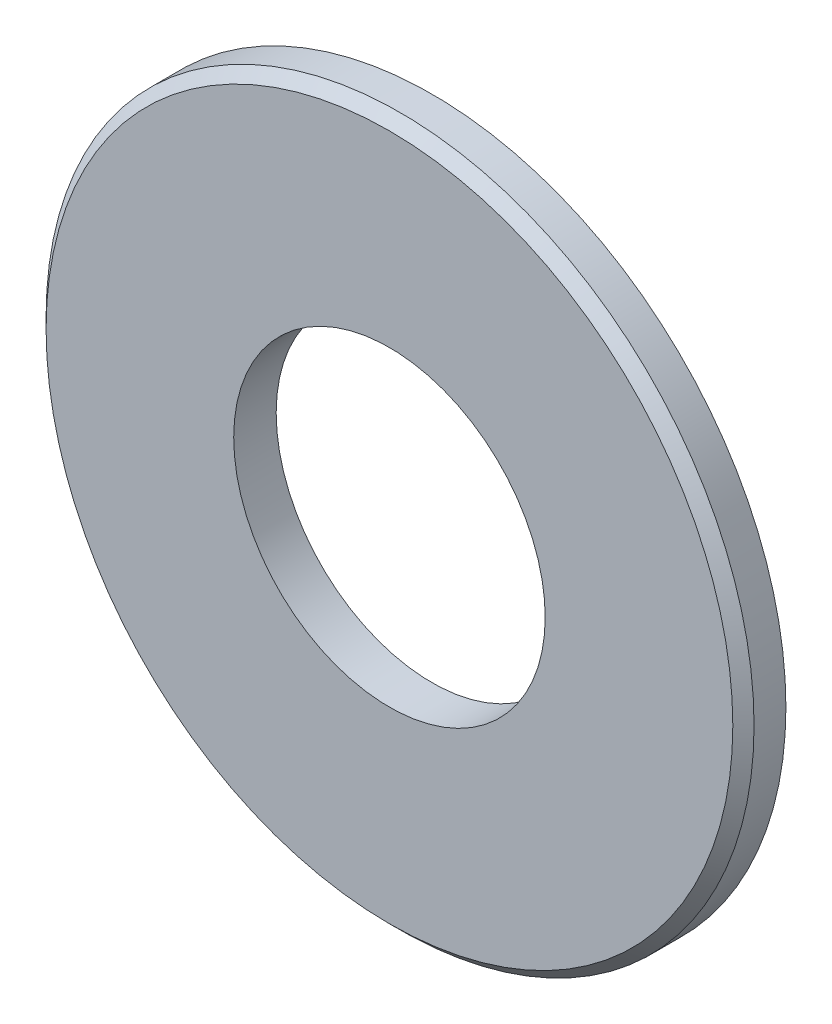
ISO-10303-21;
HEADER;
FILE_DESCRIPTION(('STEP AP214'),'2;1');
FILE_NAME('part.step','',(''),(''),'','','');
FILE_SCHEMA(('AUTOMOTIVE_DESIGN { 1 0 10303 214 1 1 1 1 }'));
ENDSEC;
DATA;
#1=APPLICATION_CONTEXT('core data for automotive mechanical design processes');
#2=APPLICATION_PROTOCOL_DEFINITION('international standard','automotive_design',2000,#1);
#3=PRODUCT_CONTEXT('',#1,'mechanical');
#4=PRODUCT('Part','Part','',(#3));
#5=PRODUCT_RELATED_PRODUCT_CATEGORY('part','',(#4));
#6=PRODUCT_DEFINITION_FORMATION('','',#4);
#7=PRODUCT_DEFINITION_CONTEXT('part definition',#1,'design');
#8=PRODUCT_DEFINITION('design','',#6,#7);
#9=PRODUCT_DEFINITION_SHAPE('','',#8);
#10=(LENGTH_UNIT() NAMED_UNIT(*) SI_UNIT(.MILLI.,.METRE.));
#11=(NAMED_UNIT(*) PLANE_ANGLE_UNIT() SI_UNIT($,.RADIAN.));
#12=(NAMED_UNIT(*) SI_UNIT($,.STERADIAN.) SOLID_ANGLE_UNIT());
#13=UNCERTAINTY_MEASURE_WITH_UNIT(LENGTH_MEASURE(1.E-05),#10,'distance_accuracy_value','');
#14=(GEOMETRIC_REPRESENTATION_CONTEXT(3) GLOBAL_UNCERTAINTY_ASSIGNED_CONTEXT((#13)) GLOBAL_UNIT_ASSIGNED_CONTEXT((#10,
#11,#12)) REPRESENTATION_CONTEXT('',''));
#15=CARTESIAN_POINT('',(0.,0.,0.));
#16=DIRECTION('',(0.,0.,1.));
#17=DIRECTION('',(1.,0.,0.));
#18=AXIS2_PLACEMENT_3D('',#15,#16,#17);
#19=CARTESIAN_POINT('',(1.7625,0.,0.15));
#20=DIRECTION('',(0.,0.,-1.));
#21=DIRECTION('',(-1.,0.,0.));
#22=AXIS2_PLACEMENT_3D('',#19,#20,#21);
#23=PLANE('',#22);
#24=CARTESIAN_POINT('',(0.,0.,0.15));
#25=DIRECTION('',(0.,0.,-1.));
#26=DIRECTION('',(-1.,0.,0.));
#27=AXIS2_PLACEMENT_3D('',#24,#25,#26);
#28=CIRCLE('',#27,2.425);
#29=CARTESIAN_POINT('',(-2.425,0.,0.15));
#30=VERTEX_POINT('',#29);
#31=EDGE_CURVE('E33',#30,#30,#28,.T.);
#32=ORIENTED_EDGE('',*,*,#31,.F.);
#33=EDGE_LOOP('',(#32));
#34=FACE_BOUND('',#33,.T.);
#35=CARTESIAN_POINT('',(0.,0.,0.15));
#36=DIRECTION('',(0.,0.,-1.));
#37=DIRECTION('',(-1.,0.,0.));
#38=AXIS2_PLACEMENT_3D('',#35,#36,#37);
#39=CIRCLE('',#38,1.1);
#40=CARTESIAN_POINT('',(-1.1,0.,0.15));
#41=VERTEX_POINT('',#40);
#42=EDGE_CURVE('E10',#41,#41,#39,.T.);
#43=ORIENTED_EDGE('',*,*,#42,.T.);
#44=EDGE_LOOP('',(#43));
#45=FACE_BOUND('',#44,.T.);
#46=ADVANCED_FACE('F14',(#34,#45),#23,.F.);
#47=CARTESIAN_POINT('',(0.,0.,2.85761549265734));
#48=DIRECTION('',(0.,0.,-1.));
#49=DIRECTION('',(-1.,0.,0.));
#50=AXIS2_PLACEMENT_3D('',#47,#48,#49);
#51=CYLINDRICAL_SURFACE('',#50,1.1);
#52=CARTESIAN_POINT('',(0.,0.,-0.15));
#53=DIRECTION('',(0.,0.,-1.));
#54=DIRECTION('',(-1.,0.,0.));
#55=AXIS2_PLACEMENT_3D('',#52,#53,#54);
#56=CIRCLE('',#55,1.1);
#57=CARTESIAN_POINT('',(-1.1,0.,-0.15));
#58=VERTEX_POINT('',#57);
#59=EDGE_CURVE('E20',#58,#58,#56,.T.);
#60=ORIENTED_EDGE('',*,*,#59,.T.);
#61=EDGE_LOOP('',(#60));
#62=FACE_BOUND('',#61,.T.);
#63=ORIENTED_EDGE('',*,*,#42,.F.);
#64=EDGE_LOOP('',(#63));
#65=FACE_BOUND('',#64,.T.);
#66=ADVANCED_FACE('F41',(#62,#65),#51,.F.);
#67=CARTESIAN_POINT('',(1.8,0.,-0.15));
#68=DIRECTION('',(0.,0.,-1.));
#69=DIRECTION('',(-1.,0.,0.));
#70=AXIS2_PLACEMENT_3D('',#67,#68,#69);
#71=PLANE('',#70);
#72=CARTESIAN_POINT('',(0.,0.,-0.15));
#73=DIRECTION('',(0.,0.,-1.));
#74=DIRECTION('',(-1.,0.,0.));
#75=AXIS2_PLACEMENT_3D('',#72,#73,#74);
#76=CIRCLE('',#75,2.5);
#77=CARTESIAN_POINT('',(-2.5,0.,-0.15));
#78=VERTEX_POINT('',#77);
#79=EDGE_CURVE('E24',#78,#78,#76,.T.);
#80=ORIENTED_EDGE('',*,*,#79,.T.);
#81=EDGE_LOOP('',(#80));
#82=FACE_BOUND('',#81,.T.);
#83=ORIENTED_EDGE('',*,*,#59,.F.);
#84=EDGE_LOOP('',(#83));
#85=FACE_BOUND('',#84,.T.);
#86=ADVANCED_FACE('F46',(#82,#85),#71,.T.);
#87=CARTESIAN_POINT('',(0.,0.,2.85761549265734));
#88=DIRECTION('',(0.,0.,-1.));
#89=DIRECTION('',(-1.,0.,0.));
#90=AXIS2_PLACEMENT_3D('',#87,#88,#89);
#91=CYLINDRICAL_SURFACE('',#90,2.5);
#92=ORIENTED_EDGE('',*,*,#79,.F.);
#93=EDGE_LOOP('',(#92));
#94=FACE_BOUND('',#93,.T.);
#95=CARTESIAN_POINT('',(0.,0.,0.075));
#96=DIRECTION('',(0.,0.,-1.));
#97=DIRECTION('',(-1.,0.,0.));
#98=AXIS2_PLACEMENT_3D('',#95,#96,#97);
#99=CIRCLE('',#98,2.5);
#100=CARTESIAN_POINT('',(-2.5,0.,0.075));
#101=VERTEX_POINT('',#100);
#102=EDGE_CURVE('E28',#101,#101,#99,.T.);
#103=ORIENTED_EDGE('',*,*,#102,.T.);
#104=EDGE_LOOP('',(#103));
#105=FACE_BOUND('',#104,.T.);
#106=ADVANCED_FACE('F50',(#94,#105),#91,.T.);
#107=CARTESIAN_POINT('',(0.,0.,0.075));
#108=DIRECTION('',(0.,0.,-1.));
#109=DIRECTION('',(-1.,0.,0.));
#110=AXIS2_PLACEMENT_3D('',#107,#108,#109);
#111=CONICAL_SURFACE('',#110,2.5,0.785398163397448);
#112=ORIENTED_EDGE('',*,*,#31,.T.);
#113=EDGE_LOOP('',(#112));
#114=FACE_BOUND('',#113,.T.);
#115=ORIENTED_EDGE('',*,*,#102,.F.);
#116=EDGE_LOOP('',(#115));
#117=FACE_BOUND('',#116,.T.);
#118=ADVANCED_FACE('F37',(#114,#117),#111,.T.);
#119=CLOSED_SHELL('',(#46,#66,#86,#106,#118));
#120=MANIFOLD_SOLID_BREP('B1',#119);
#121=ADVANCED_BREP_SHAPE_REPRESENTATION('',(#18,#120),#14);
#122=SHAPE_DEFINITION_REPRESENTATION(#9,#121);
ENDSEC;
END-ISO-10303-21;
